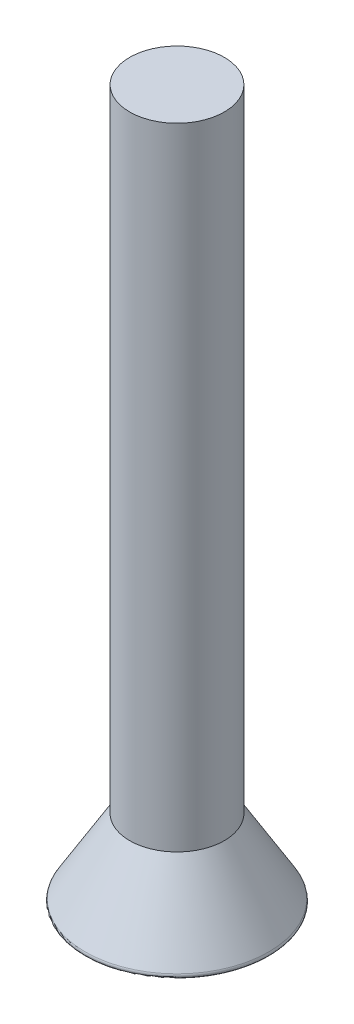
ISO-10303-21;
HEADER;
FILE_DESCRIPTION(('STEP AP214'),'2;1');
FILE_NAME('part.step','',(''),(''),'','','');
FILE_SCHEMA(('AUTOMOTIVE_DESIGN { 1 0 10303 214 1 1 1 1 }'));
ENDSEC;
DATA;
#1=APPLICATION_CONTEXT('core data for automotive mechanical design processes');
#2=APPLICATION_PROTOCOL_DEFINITION('international standard','automotive_design',2000,#1);
#3=PRODUCT_CONTEXT('',#1,'mechanical');
#4=PRODUCT('Part','Part','',(#3));
#5=PRODUCT_RELATED_PRODUCT_CATEGORY('part','',(#4));
#6=PRODUCT_DEFINITION_FORMATION('','',#4);
#7=PRODUCT_DEFINITION_CONTEXT('part definition',#1,'design');
#8=PRODUCT_DEFINITION('design','',#6,#7);
#9=PRODUCT_DEFINITION_SHAPE('','',#8);
#10=(LENGTH_UNIT() NAMED_UNIT(*) SI_UNIT(.MILLI.,.METRE.));
#11=(NAMED_UNIT(*) PLANE_ANGLE_UNIT() SI_UNIT($,.RADIAN.));
#12=(NAMED_UNIT(*) SI_UNIT($,.STERADIAN.) SOLID_ANGLE_UNIT());
#13=UNCERTAINTY_MEASURE_WITH_UNIT(LENGTH_MEASURE(1.E-05),#10,'distance_accuracy_value','');
#14=(GEOMETRIC_REPRESENTATION_CONTEXT(3) GLOBAL_UNCERTAINTY_ASSIGNED_CONTEXT((#13)) GLOBAL_UNIT_ASSIGNED_CONTEXT((#10,
#11,#12)) REPRESENTATION_CONTEXT('',''));
#15=CARTESIAN_POINT('',(0.,0.,0.));
#16=DIRECTION('',(0.,0.,1.));
#17=DIRECTION('',(1.,0.,0.));
#18=AXIS2_PLACEMENT_3D('',#15,#16,#17);
#19=CARTESIAN_POINT('',(0.,0.,0.));
#20=DIRECTION('',(0.,1.,0.));
#21=DIRECTION('',(0.,0.,1.));
#22=AXIS2_PLACEMENT_3D('',#19,#20,#21);
#23=PLANE('',#22);
#24=CARTESIAN_POINT('',(0.,0.,0.));
#25=DIRECTION('',(0.,1.,0.));
#26=DIRECTION('',(0.,0.,1.));
#27=AXIS2_PLACEMENT_3D('',#24,#25,#26);
#28=CIRCLE('',#27,2.82338096210308);
#29=CARTESIAN_POINT('',(0.,0.,2.82338096210308));
#30=VERTEX_POINT('',#29);
#31=EDGE_CURVE('E229',#30,#30,#28,.F.);
#32=ORIENTED_EDGE('',*,*,#31,.T.);
#33=EDGE_LOOP('',(#32));
#34=FACE_BOUND('',#33,.T.);
#35=DIRECTION('',(0.,0.,-1.));
#36=VECTOR('',#35,1.);
#37=CARTESIAN_POINT('',(0.5,0.,0.));
#38=LINE('',#37,#36);
#39=CARTESIAN_POINT('',(0.5,0.,-0.5));
#40=VERTEX_POINT('',#39);
#41=CARTESIAN_POINT('',(0.5,0.,-1.5));
#42=VERTEX_POINT('',#41);
#43=EDGE_CURVE('E153',#40,#42,#38,.T.);
#44=ORIENTED_EDGE('',*,*,#43,.T.);
#45=DIRECTION('',(-1.,0.,0.));
#46=VECTOR('',#45,1.);
#47=CARTESIAN_POINT('',(0.,0.,-1.5));
#48=LINE('',#47,#46);
#49=CARTESIAN_POINT('',(-0.5,0.,-1.5));
#50=VERTEX_POINT('',#49);
#51=EDGE_CURVE('E214',#42,#50,#48,.T.);
#52=ORIENTED_EDGE('',*,*,#51,.T.);
#53=DIRECTION('',(0.,0.,-1.));
#54=VECTOR('',#53,1.);
#55=CARTESIAN_POINT('',(-0.5,0.,0.));
#56=LINE('',#55,#54);
#57=CARTESIAN_POINT('',(-0.5,0.,-0.5));
#58=VERTEX_POINT('',#57);
#59=EDGE_CURVE('E211',#58,#50,#56,.T.);
#60=ORIENTED_EDGE('',*,*,#59,.F.);
#61=DIRECTION('',(-1.,0.,0.));
#62=VECTOR('',#61,1.);
#63=CARTESIAN_POINT('',(0.,0.,-0.5));
#64=LINE('',#63,#62);
#65=CARTESIAN_POINT('',(-1.5,0.,-0.5));
#66=VERTEX_POINT('',#65);
#67=EDGE_CURVE('E208',#58,#66,#64,.T.);
#68=ORIENTED_EDGE('',*,*,#67,.T.);
#69=DIRECTION('',(0.,0.,-1.));
#70=VECTOR('',#69,1.);
#71=CARTESIAN_POINT('',(-1.5,0.,0.));
#72=LINE('',#71,#70);
#73=CARTESIAN_POINT('',(-1.5,0.,0.5));
#74=VERTEX_POINT('',#73);
#75=EDGE_CURVE('E204',#74,#66,#72,.T.);
#76=ORIENTED_EDGE('',*,*,#75,.F.);
#77=DIRECTION('',(-1.,0.,0.));
#78=VECTOR('',#77,1.);
#79=CARTESIAN_POINT('',(0.,0.,0.5));
#80=LINE('',#79,#78);
#81=CARTESIAN_POINT('',(-0.5,0.,0.5));
#82=VERTEX_POINT('',#81);
#83=EDGE_CURVE('E200',#82,#74,#80,.T.);
#84=ORIENTED_EDGE('',*,*,#83,.F.);
#85=DIRECTION('',(0.,0.,-1.));
#86=VECTOR('',#85,1.);
#87=CARTESIAN_POINT('',(-0.5,0.,0.));
#88=LINE('',#87,#86);
#89=CARTESIAN_POINT('',(-0.5,0.,1.5));
#90=VERTEX_POINT('',#89);
#91=EDGE_CURVE('E196',#90,#82,#88,.T.);
#92=ORIENTED_EDGE('',*,*,#91,.F.);
#93=DIRECTION('',(-1.,0.,0.));
#94=VECTOR('',#93,1.);
#95=CARTESIAN_POINT('',(0.,0.,1.5));
#96=LINE('',#95,#94);
#97=CARTESIAN_POINT('',(0.5,0.,1.5));
#98=VERTEX_POINT('',#97);
#99=EDGE_CURVE('E192',#98,#90,#96,.T.);
#100=ORIENTED_EDGE('',*,*,#99,.F.);
#101=DIRECTION('',(0.,0.,-1.));
#102=VECTOR('',#101,1.);
#103=CARTESIAN_POINT('',(0.5,0.,0.));
#104=LINE('',#103,#102);
#105=CARTESIAN_POINT('',(0.5,0.,0.5));
#106=VERTEX_POINT('',#105);
#107=EDGE_CURVE('E189',#98,#106,#104,.T.);
#108=ORIENTED_EDGE('',*,*,#107,.T.);
#109=DIRECTION('',(-1.,0.,0.));
#110=VECTOR('',#109,1.);
#111=CARTESIAN_POINT('',(0.,0.,0.5));
#112=LINE('',#111,#110);
#113=CARTESIAN_POINT('',(1.5,0.,0.5));
#114=VERTEX_POINT('',#113);
#115=EDGE_CURVE('E136',#114,#106,#112,.T.);
#116=ORIENTED_EDGE('',*,*,#115,.F.);
#117=DIRECTION('',(0.,0.,-1.));
#118=VECTOR('',#117,1.);
#119=CARTESIAN_POINT('',(1.5,0.,0.));
#120=LINE('',#119,#118);
#121=CARTESIAN_POINT('',(1.5,0.,-0.5));
#122=VERTEX_POINT('',#121);
#123=EDGE_CURVE('E131',#114,#122,#120,.T.);
#124=ORIENTED_EDGE('',*,*,#123,.T.);
#125=DIRECTION('',(-1.,0.,0.));
#126=VECTOR('',#125,1.);
#127=CARTESIAN_POINT('',(0.,0.,-0.5));
#128=LINE('',#127,#126);
#129=EDGE_CURVE('E133',#122,#40,#128,.T.);
#130=ORIENTED_EDGE('',*,*,#129,.T.);
#131=EDGE_LOOP('',(#44,#52,#60,#68,#76,#84,#92,#100,#108,#116,#124,#130));
#132=FACE_BOUND('',#131,.T.);
#133=ADVANCED_FACE('F41',(#34,#132),#23,.F.);
#134=CARTESIAN_POINT('',(0.,22.5,0.));
#135=DIRECTION('',(0.,-1.,0.));
#136=DIRECTION('',(0.,0.,-1.));
#137=AXIS2_PLACEMENT_3D('',#134,#135,#136);
#138=CYLINDRICAL_SURFACE('',#137,1.5);
#139=CARTESIAN_POINT('',(0.,22.5,0.));
#140=DIRECTION('',(0.,1.,0.));
#141=DIRECTION('',(0.,0.,1.));
#142=AXIS2_PLACEMENT_3D('',#139,#140,#141);
#143=CIRCLE('',#142,1.5);
#144=CARTESIAN_POINT('',(0.,22.5,1.5));
#145=VERTEX_POINT('',#144);
#146=EDGE_CURVE('E217',#145,#145,#143,.T.);
#147=ORIENTED_EDGE('',*,*,#146,.F.);
#148=EDGE_LOOP('',(#147));
#149=FACE_BOUND('',#148,.T.);
#150=CARTESIAN_POINT('',(0.,2.5,0.));
#151=DIRECTION('',(0.,1.,0.));
#152=DIRECTION('',(0.,0.,1.));
#153=AXIS2_PLACEMENT_3D('',#150,#151,#152);
#154=CIRCLE('',#153,1.5);
#155=CARTESIAN_POINT('',(0.,2.5,1.5));
#156=VERTEX_POINT('',#155);
#157=EDGE_CURVE('E221',#156,#156,#154,.T.);
#158=ORIENTED_EDGE('',*,*,#157,.T.);
#159=EDGE_LOOP('',(#158));
#160=FACE_BOUND('',#159,.T.);
#161=ADVANCED_FACE('F321',(#149,#160),#138,.T.);
#162=CARTESIAN_POINT('',(0.,22.5,0.));
#163=DIRECTION('',(0.,1.,0.));
#164=DIRECTION('',(0.,0.,1.));
#165=AXIS2_PLACEMENT_3D('',#162,#163,#164);
#166=PLANE('',#165);
#167=ORIENTED_EDGE('',*,*,#146,.T.);
#168=EDGE_LOOP('',(#167));
#169=FACE_BOUND('',#168,.T.);
#170=ADVANCED_FACE('F327',(#169),#166,.T.);
#171=CARTESIAN_POINT('',(0.,2.5,0.));
#172=DIRECTION('',(0.,-1.,0.));
#173=DIRECTION('',(0.,0.,-1.));
#174=AXIS2_PLACEMENT_3D('',#171,#172,#173);
#175=CONICAL_SURFACE('',#174,1.49999999999999,0.540419500270582);
#176=CARTESIAN_POINT('',(0.,0.151449575542752,0.));
#177=DIRECTION('',(0.,-1.,0.));
#178=DIRECTION('',(0.,0.,-1.));
#179=AXIS2_PLACEMENT_3D('',#176,#177,#178);
#180=CIRCLE('',#179,2.90913025467434);
#181=CARTESIAN_POINT('',(0.,0.151449575542752,-2.90913025467434));
#182=VERTEX_POINT('',#181);
#183=EDGE_CURVE('E225',#182,#182,#180,.F.);
#184=ORIENTED_EDGE('',*,*,#183,.T.);
#185=EDGE_LOOP('',(#184));
#186=FACE_BOUND('',#185,.T.);
#187=ORIENTED_EDGE('',*,*,#157,.F.);
#188=EDGE_LOOP('',(#187));
#189=FACE_BOUND('',#188,.T.);
#190=ADVANCED_FACE('F333',(#186,#189),#175,.T.);
#191=CARTESIAN_POINT('',(0.,0.0999999999999998,0.));
#192=DIRECTION('',(0.,1.,0.));
#193=DIRECTION('',(0.,0.,1.));
#194=AXIS2_PLACEMENT_3D('',#191,#192,#193);
#195=TOROIDAL_SURFACE('',#194,2.82338096210308,0.1);
#196=ORIENTED_EDGE('',*,*,#31,.F.);
#197=EDGE_LOOP('',(#196));
#198=FACE_BOUND('',#197,.T.);
#199=ORIENTED_EDGE('',*,*,#183,.F.);
#200=EDGE_LOOP('',(#199));
#201=FACE_BOUND('',#200,.T.);
#202=ADVANCED_FACE('F338',(#198,#201),#195,.T.);
#203=CARTESIAN_POINT('',(0.,1.5,0.));
#204=DIRECTION('',(0.,-1.,0.));
#205=DIRECTION('',(0.,0.,-1.));
#206=AXIS2_PLACEMENT_3D('',#203,#204,#205);
#207=PLANE('',#206);
#208=DIRECTION('',(0.,0.,1.));
#209=VECTOR('',#208,1.);
#210=CARTESIAN_POINT('',(0.2,1.5,1.5));
#211=LINE('',#210,#209);
#212=CARTESIAN_POINT('',(0.2,1.5,0.2));
#213=VERTEX_POINT('',#212);
#214=CARTESIAN_POINT('',(0.2,1.5,1.2));
#215=VERTEX_POINT('',#214);
#216=EDGE_CURVE('E52',#213,#215,#211,.T.);
#217=ORIENTED_EDGE('',*,*,#216,.T.);
#218=DIRECTION('',(-1.,0.,0.));
#219=VECTOR('',#218,1.);
#220=CARTESIAN_POINT('',(0.,1.5,1.2));
#221=LINE('',#220,#219);
#222=CARTESIAN_POINT('',(-0.2,1.5,1.2));
#223=VERTEX_POINT('',#222);
#224=EDGE_CURVE('E11',#215,#223,#221,.T.);
#225=ORIENTED_EDGE('',*,*,#224,.T.);
#226=DIRECTION('',(0.,0.,-1.));
#227=VECTOR('',#226,1.);
#228=CARTESIAN_POINT('',(-0.2,1.5,0.));
#229=LINE('',#228,#227);
#230=CARTESIAN_POINT('',(-0.2,1.5,0.2));
#231=VERTEX_POINT('',#230);
#232=EDGE_CURVE('E256',#223,#231,#229,.T.);
#233=ORIENTED_EDGE('',*,*,#232,.T.);
#234=DIRECTION('',(-1.,0.,0.));
#235=VECTOR('',#234,1.);
#236=CARTESIAN_POINT('',(0.,1.5,0.2));
#237=LINE('',#236,#235);
#238=CARTESIAN_POINT('',(-1.2,1.5,0.2));
#239=VERTEX_POINT('',#238);
#240=EDGE_CURVE('E253',#231,#239,#237,.T.);
#241=ORIENTED_EDGE('',*,*,#240,.T.);
#242=DIRECTION('',(0.,0.,-1.));
#243=VECTOR('',#242,1.);
#244=CARTESIAN_POINT('',(-1.2,1.5,0.));
#245=LINE('',#244,#243);
#246=CARTESIAN_POINT('',(-1.2,1.5,-0.2));
#247=VERTEX_POINT('',#246);
#248=EDGE_CURVE('E250',#239,#247,#245,.T.);
#249=ORIENTED_EDGE('',*,*,#248,.T.);
#250=DIRECTION('',(1.,0.,0.));
#251=VECTOR('',#250,1.);
#252=CARTESIAN_POINT('',(-0.5,1.5,-0.2));
#253=LINE('',#252,#251);
#254=CARTESIAN_POINT('',(-0.2,1.5,-0.2));
#255=VERTEX_POINT('',#254);
#256=EDGE_CURVE('E239',#247,#255,#253,.T.);
#257=ORIENTED_EDGE('',*,*,#256,.T.);
#258=DIRECTION('',(0.,0.,-1.));
#259=VECTOR('',#258,1.);
#260=CARTESIAN_POINT('',(-0.2,1.5,0.));
#261=LINE('',#260,#259);
#262=CARTESIAN_POINT('',(-0.2,1.5,-1.2));
#263=VERTEX_POINT('',#262);
#264=EDGE_CURVE('E236',#255,#263,#261,.T.);
#265=ORIENTED_EDGE('',*,*,#264,.T.);
#266=DIRECTION('',(1.,0.,0.));
#267=VECTOR('',#266,1.);
#268=CARTESIAN_POINT('',(0.5,1.5,-1.2));
#269=LINE('',#268,#267);
#270=CARTESIAN_POINT('',(0.2,1.5,-1.2));
#271=VERTEX_POINT('',#270);
#272=EDGE_CURVE('E233',#263,#271,#269,.T.);
#273=ORIENTED_EDGE('',*,*,#272,.T.);
#274=DIRECTION('',(0.,0.,1.));
#275=VECTOR('',#274,1.);
#276=CARTESIAN_POINT('',(0.2,1.5,-0.5));
#277=LINE('',#276,#275);
#278=CARTESIAN_POINT('',(0.2,1.5,-0.2));
#279=VERTEX_POINT('',#278);
#280=EDGE_CURVE('E242',#271,#279,#277,.T.);
#281=ORIENTED_EDGE('',*,*,#280,.T.);
#282=DIRECTION('',(1.,0.,0.));
#283=VECTOR('',#282,1.);
#284=CARTESIAN_POINT('',(1.5,1.5,-0.2));
#285=LINE('',#284,#283);
#286=CARTESIAN_POINT('',(1.2,1.5,-0.2));
#287=VERTEX_POINT('',#286);
#288=EDGE_CURVE('E245',#279,#287,#285,.T.);
#289=ORIENTED_EDGE('',*,*,#288,.T.);
#290=DIRECTION('',(0.,0.,1.));
#291=VECTOR('',#290,1.);
#292=CARTESIAN_POINT('',(1.2,1.5,0.5));
#293=LINE('',#292,#291);
#294=CARTESIAN_POINT('',(1.2,1.5,0.2));
#295=VERTEX_POINT('',#294);
#296=EDGE_CURVE('E156',#287,#295,#293,.T.);
#297=ORIENTED_EDGE('',*,*,#296,.T.);
#298=DIRECTION('',(-1.,0.,0.));
#299=VECTOR('',#298,1.);
#300=CARTESIAN_POINT('',(0.,1.5,0.2));
#301=LINE('',#300,#299);
#302=EDGE_CURVE('E63',#295,#213,#301,.T.);
#303=ORIENTED_EDGE('',*,*,#302,.T.);
#304=EDGE_LOOP('',(#217,#225,#233,#241,#249,#257,#265,#273,#281,#289,#297,#303));
#305=FACE_BOUND('',#304,.T.);
#306=ADVANCED_FACE('F292',(#305),#207,.T.);
#307=CARTESIAN_POINT('',(0.,0.,-1.5));
#308=DIRECTION('',(0.,-0.196116135138187,0.98058067569092));
#309=DIRECTION('',(1.,0.,0.));
#310=AXIS2_PLACEMENT_3D('',#307,#308,#309);
#311=PLANE('',#310);
#312=DIRECTION('',(0.192450089729878,0.962250448649375,0.192450089729878));
#313=VECTOR('',#312,1.);
#314=CARTESIAN_POINT('',(-0.155555555555554,1.72222222222222,-1.15555555555555));
#315=LINE('',#314,#313);
#316=EDGE_CURVE('E171',#50,#263,#315,.T.);
#317=ORIENTED_EDGE('',*,*,#316,.F.);
#318=ORIENTED_EDGE('',*,*,#51,.F.);
#319=DIRECTION('',(-0.192450089729878,0.962250448649375,0.192450089729878));
#320=VECTOR('',#319,1.);
#321=CARTESIAN_POINT('',(0.444444444444443,0.277777777777804,-1.44444444444444));
#322=LINE('',#321,#320);
#323=EDGE_CURVE('E46',#271,#42,#322,.F.);
#324=ORIENTED_EDGE('',*,*,#323,.F.);
#325=ORIENTED_EDGE('',*,*,#272,.F.);
#326=EDGE_LOOP('',(#317,#318,#324,#325));
#327=FACE_BOUND('',#326,.T.);
#328=ADVANCED_FACE('F44',(#327),#311,.T.);
#329=CARTESIAN_POINT('',(0.5,0.,0.));
#330=DIRECTION('',(-0.98058067569092,-0.196116135138187,0.));
#331=DIRECTION('',(0.,0.,1.));
#332=AXIS2_PLACEMENT_3D('',#329,#330,#331);
#333=PLANE('',#332);
#334=ORIENTED_EDGE('',*,*,#323,.T.);
#335=ORIENTED_EDGE('',*,*,#43,.F.);
#336=DIRECTION('',(-0.192450089729878,0.962250448649375,0.192450089729878));
#337=VECTOR('',#336,1.);
#338=CARTESIAN_POINT('',(0.481481481481481,0.0925925925926168,-0.481481481481481));
#339=LINE('',#338,#337);
#340=EDGE_CURVE('E151',#279,#40,#339,.F.);
#341=ORIENTED_EDGE('',*,*,#340,.F.);
#342=ORIENTED_EDGE('',*,*,#280,.F.);
#343=EDGE_LOOP('',(#334,#335,#341,#342));
#344=FACE_BOUND('',#343,.T.);
#345=ADVANCED_FACE('F312',(#344),#333,.T.);
#346=CARTESIAN_POINT('',(-0.2,1.5,0.));
#347=DIRECTION('',(-0.98058067569092,0.196116135138187,0.));
#348=DIRECTION('',(0.,0.,-1.));
#349=AXIS2_PLACEMENT_3D('',#346,#347,#348);
#350=PLANE('',#349);
#351=ORIENTED_EDGE('',*,*,#316,.T.);
#352=ORIENTED_EDGE('',*,*,#264,.F.);
#353=DIRECTION('',(0.192450089729878,0.962250448649375,0.192450089729878));
#354=VECTOR('',#353,1.);
#355=CARTESIAN_POINT('',(-0.192592592592592,1.53703703703704,-0.192592592592593));
#356=LINE('',#355,#354);
#357=EDGE_CURVE('E158',#58,#255,#356,.T.);
#358=ORIENTED_EDGE('',*,*,#357,.F.);
#359=ORIENTED_EDGE('',*,*,#59,.T.);
#360=EDGE_LOOP('',(#351,#352,#358,#359));
#361=FACE_BOUND('',#360,.T.);
#362=ADVANCED_FACE('F309',(#361),#350,.F.);
#363=CARTESIAN_POINT('',(0.,0.,-0.5));
#364=DIRECTION('',(0.,-0.196116135138187,0.98058067569092));
#365=DIRECTION('',(1.,0.,0.));
#366=AXIS2_PLACEMENT_3D('',#363,#364,#365);
#367=PLANE('',#366);
#368=ORIENTED_EDGE('',*,*,#340,.T.);
#369=ORIENTED_EDGE('',*,*,#129,.F.);
#370=DIRECTION('',(-0.192450089729878,0.962250448649375,0.192450089729878));
#371=VECTOR('',#370,1.);
#372=CARTESIAN_POINT('',(1.48148148148148,0.0925925925926167,-0.481481481481481));
#373=LINE('',#372,#371);
#374=EDGE_CURVE('E148',#287,#122,#373,.F.);
#375=ORIENTED_EDGE('',*,*,#374,.F.);
#376=ORIENTED_EDGE('',*,*,#288,.F.);
#377=EDGE_LOOP('',(#368,#369,#375,#376));
#378=FACE_BOUND('',#377,.T.);
#379=ADVANCED_FACE('F146',(#378),#367,.T.);
#380=CARTESIAN_POINT('',(0.,0.,-0.5));
#381=DIRECTION('',(0.,-0.196116135138187,0.98058067569092));
#382=DIRECTION('',(1.,0.,0.));
#383=AXIS2_PLACEMENT_3D('',#380,#381,#382);
#384=PLANE('',#383);
#385=ORIENTED_EDGE('',*,*,#357,.T.);
#386=ORIENTED_EDGE('',*,*,#256,.F.);
#387=DIRECTION('',(0.192450089729878,0.962250448649375,0.192450089729878));
#388=VECTOR('',#387,1.);
#389=CARTESIAN_POINT('',(-1.19259259259259,1.53703703703704,-0.192592592592593));
#390=LINE('',#389,#388);
#391=EDGE_CURVE('E159',#66,#247,#390,.T.);
#392=ORIENTED_EDGE('',*,*,#391,.F.);
#393=ORIENTED_EDGE('',*,*,#67,.F.);
#394=EDGE_LOOP('',(#385,#386,#392,#393));
#395=FACE_BOUND('',#394,.T.);
#396=ADVANCED_FACE('F307',(#395),#384,.T.);
#397=CARTESIAN_POINT('',(1.5,0.,0.));
#398=DIRECTION('',(-0.98058067569092,-0.196116135138187,0.));
#399=DIRECTION('',(0.,0.,1.));
#400=AXIS2_PLACEMENT_3D('',#397,#398,#399);
#401=PLANE('',#400);
#402=ORIENTED_EDGE('',*,*,#374,.T.);
#403=ORIENTED_EDGE('',*,*,#123,.F.);
#404=DIRECTION('',(0.192450089729878,-0.962250448649375,0.192450089729878));
#405=VECTOR('',#404,1.);
#406=CARTESIAN_POINT('',(1.15555555555556,1.72222222222223,0.155555555555555));
#407=LINE('',#406,#405);
#408=EDGE_CURVE('E166',#295,#114,#407,.T.);
#409=ORIENTED_EDGE('',*,*,#408,.F.);
#410=ORIENTED_EDGE('',*,*,#296,.F.);
#411=EDGE_LOOP('',(#402,#403,#409,#410));
#412=FACE_BOUND('',#411,.T.);
#413=ADVANCED_FACE('F155',(#412),#401,.T.);
#414=CARTESIAN_POINT('',(-1.2,1.5,0.));
#415=DIRECTION('',(-0.98058067569092,0.196116135138187,0.));
#416=DIRECTION('',(0.,0.,-1.));
#417=AXIS2_PLACEMENT_3D('',#414,#415,#416);
#418=PLANE('',#417);
#419=ORIENTED_EDGE('',*,*,#391,.T.);
#420=ORIENTED_EDGE('',*,*,#248,.F.);
#421=DIRECTION('',(-0.192450089729878,-0.962250448649375,0.192450089729878));
#422=VECTOR('',#421,1.);
#423=CARTESIAN_POINT('',(-1.15555555555555,1.72222222222222,0.155555555555554));
#424=LINE('',#423,#422);
#425=EDGE_CURVE('E277',#74,#239,#424,.F.);
#426=ORIENTED_EDGE('',*,*,#425,.F.);
#427=ORIENTED_EDGE('',*,*,#75,.T.);
#428=EDGE_LOOP('',(#419,#420,#426,#427));
#429=FACE_BOUND('',#428,.T.);
#430=ADVANCED_FACE('F304',(#429),#418,.F.);
#431=CARTESIAN_POINT('',(0.,1.5,0.2));
#432=DIRECTION('',(0.,0.196116135138187,0.98058067569092));
#433=DIRECTION('',(-1.,0.,0.));
#434=AXIS2_PLACEMENT_3D('',#431,#432,#433);
#435=PLANE('',#434);
#436=ORIENTED_EDGE('',*,*,#408,.T.);
#437=ORIENTED_EDGE('',*,*,#115,.T.);
#438=DIRECTION('',(0.192450089729878,-0.962250448649375,0.192450089729878));
#439=VECTOR('',#438,1.);
#440=CARTESIAN_POINT('',(0.192592592592592,1.53703703703704,0.192592592592593));
#441=LINE('',#440,#439);
#442=EDGE_CURVE('E273',#213,#106,#441,.T.);
#443=ORIENTED_EDGE('',*,*,#442,.F.);
#444=ORIENTED_EDGE('',*,*,#302,.F.);
#445=EDGE_LOOP('',(#436,#437,#443,#444));
#446=FACE_BOUND('',#445,.T.);
#447=ADVANCED_FACE('F282',(#446),#435,.F.);
#448=CARTESIAN_POINT('',(0.,1.5,0.2));
#449=DIRECTION('',(0.,0.196116135138187,0.98058067569092));
#450=DIRECTION('',(-1.,0.,0.));
#451=AXIS2_PLACEMENT_3D('',#448,#449,#450);
#452=PLANE('',#451);
#453=ORIENTED_EDGE('',*,*,#425,.T.);
#454=ORIENTED_EDGE('',*,*,#240,.F.);
#455=DIRECTION('',(-0.192450089729878,-0.962250448649375,0.192450089729878));
#456=VECTOR('',#455,1.);
#457=CARTESIAN_POINT('',(-0.192592592592592,1.53703703703704,0.192592592592592));
#458=LINE('',#457,#456);
#459=EDGE_CURVE('E269',#82,#231,#458,.F.);
#460=ORIENTED_EDGE('',*,*,#459,.F.);
#461=ORIENTED_EDGE('',*,*,#83,.T.);
#462=EDGE_LOOP('',(#453,#454,#460,#461));
#463=FACE_BOUND('',#462,.T.);
#464=ADVANCED_FACE('F298',(#463),#452,.F.);
#465=CARTESIAN_POINT('',(0.5,0.,0.));
#466=DIRECTION('',(-0.98058067569092,-0.196116135138187,0.));
#467=DIRECTION('',(0.,0.,1.));
#468=AXIS2_PLACEMENT_3D('',#465,#466,#467);
#469=PLANE('',#468);
#470=ORIENTED_EDGE('',*,*,#442,.T.);
#471=ORIENTED_EDGE('',*,*,#107,.F.);
#472=DIRECTION('',(0.192450089729878,-0.962250448649375,0.192450089729878));
#473=VECTOR('',#472,1.);
#474=CARTESIAN_POINT('',(0.192592592592592,1.53703703703704,1.19259259259259));
#475=LINE('',#474,#473);
#476=EDGE_CURVE('E266',#215,#98,#475,.T.);
#477=ORIENTED_EDGE('',*,*,#476,.F.);
#478=ORIENTED_EDGE('',*,*,#216,.F.);
#479=EDGE_LOOP('',(#470,#471,#477,#478));
#480=FACE_BOUND('',#479,.T.);
#481=ADVANCED_FACE('F285',(#480),#469,.T.);
#482=CARTESIAN_POINT('',(-0.2,1.5,0.));
#483=DIRECTION('',(-0.98058067569092,0.196116135138187,0.));
#484=DIRECTION('',(0.,0.,-1.));
#485=AXIS2_PLACEMENT_3D('',#482,#483,#484);
#486=PLANE('',#485);
#487=ORIENTED_EDGE('',*,*,#459,.T.);
#488=ORIENTED_EDGE('',*,*,#232,.F.);
#489=DIRECTION('',(-0.192450089729878,-0.962250448649375,0.192450089729878));
#490=VECTOR('',#489,1.);
#491=CARTESIAN_POINT('',(-0.192592592592593,1.53703703703704,1.19259259259259));
#492=LINE('',#491,#490);
#493=EDGE_CURVE('E263',#90,#223,#492,.F.);
#494=ORIENTED_EDGE('',*,*,#493,.F.);
#495=ORIENTED_EDGE('',*,*,#91,.T.);
#496=EDGE_LOOP('',(#487,#488,#494,#495));
#497=FACE_BOUND('',#496,.T.);
#498=ADVANCED_FACE('F300',(#497),#486,.F.);
#499=CARTESIAN_POINT('',(0.,1.5,1.2));
#500=DIRECTION('',(0.,0.196116135138187,0.98058067569092));
#501=DIRECTION('',(-1.,0.,0.));
#502=AXIS2_PLACEMENT_3D('',#499,#500,#501);
#503=PLANE('',#502);
#504=ORIENTED_EDGE('',*,*,#476,.T.);
#505=ORIENTED_EDGE('',*,*,#99,.T.);
#506=ORIENTED_EDGE('',*,*,#493,.T.);
#507=ORIENTED_EDGE('',*,*,#224,.F.);
#508=EDGE_LOOP('',(#504,#505,#506,#507));
#509=FACE_BOUND('',#508,.T.);
#510=ADVANCED_FACE('F289',(#509),#503,.F.);
#511=CLOSED_SHELL('',(#133,#161,#170,#190,#202,#306,#328,#345,#362,#379,#396,#413,#430,#447,
#464,#481,#498,#510));
#512=MANIFOLD_SOLID_BREP('B2',#511);
#513=ADVANCED_BREP_SHAPE_REPRESENTATION('',(#18,#512),#14);
#514=SHAPE_DEFINITION_REPRESENTATION(#9,#513);
ENDSEC;
END-ISO-10303-21;
